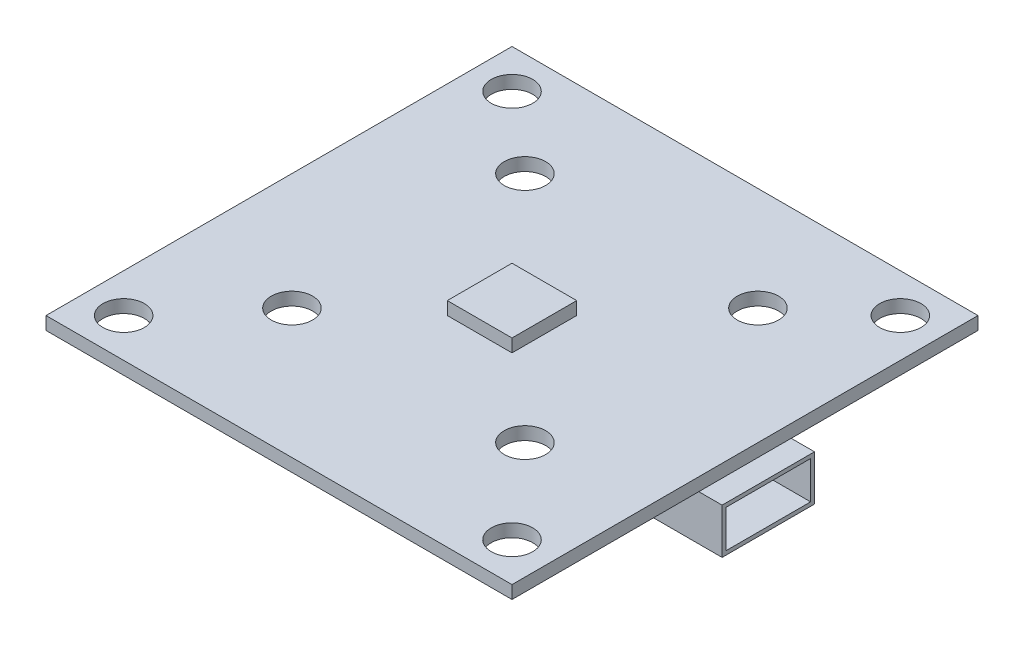
ISO-10303-21;
HEADER;
FILE_DESCRIPTION(('STEP AP214'),'2;1');
FILE_NAME('part.step','',(''),(''),'','','');
FILE_SCHEMA(('AUTOMOTIVE_DESIGN { 1 0 10303 214 1 1 1 1 }'));
ENDSEC;
DATA;
#1=APPLICATION_CONTEXT('core data for automotive mechanical design processes');
#2=APPLICATION_PROTOCOL_DEFINITION('international standard','automotive_design',2000,#1);
#3=PRODUCT_CONTEXT('',#1,'mechanical');
#4=PRODUCT('Part','Part','',(#3));
#5=PRODUCT_RELATED_PRODUCT_CATEGORY('part','',(#4));
#6=PRODUCT_DEFINITION_FORMATION('','',#4);
#7=PRODUCT_DEFINITION_CONTEXT('part definition',#1,'design');
#8=PRODUCT_DEFINITION('design','',#6,#7);
#9=PRODUCT_DEFINITION_SHAPE('','',#8);
#10=(LENGTH_UNIT() NAMED_UNIT(*) SI_UNIT(.MILLI.,.METRE.));
#11=(NAMED_UNIT(*) PLANE_ANGLE_UNIT() SI_UNIT($,.RADIAN.));
#12=(NAMED_UNIT(*) SI_UNIT($,.STERADIAN.) SOLID_ANGLE_UNIT());
#13=UNCERTAINTY_MEASURE_WITH_UNIT(LENGTH_MEASURE(1.E-05),#10,'distance_accuracy_value','');
#14=(GEOMETRIC_REPRESENTATION_CONTEXT(3) GLOBAL_UNCERTAINTY_ASSIGNED_CONTEXT((#13)) GLOBAL_UNIT_ASSIGNED_CONTEXT((#10,
#11,#12)) REPRESENTATION_CONTEXT('',''));
#15=CARTESIAN_POINT('',(0.,0.,0.));
#16=DIRECTION('',(0.,0.,1.));
#17=DIRECTION('',(1.,0.,0.));
#18=AXIS2_PLACEMENT_3D('',#15,#16,#17);
#19=CARTESIAN_POINT('',(19.8,-3.5,3.56877157481258));
#20=DIRECTION('',(-1.,0.,0.));
#21=DIRECTION('',(0.,0.,1.));
#22=AXIS2_PLACEMENT_3D('',#19,#20,#21);
#23=PLANE('',#22);
#24=DIRECTION('',(0.,0.,1.));
#25=VECTOR('',#24,1.);
#26=CARTESIAN_POINT('',(19.8,0.,3.56877157481258));
#27=LINE('',#26,#25);
#28=CARTESIAN_POINT('',(19.8,0.,-3.56877157481258));
#29=VERTEX_POINT('',#28);
#30=CARTESIAN_POINT('',(19.8,0.,3.56877157481258));
#31=VERTEX_POINT('',#30);
#32=EDGE_CURVE('E154',#29,#31,#27,.T.);
#33=ORIENTED_EDGE('',*,*,#32,.T.);
#34=DIRECTION('',(0.,1.,0.));
#35=VECTOR('',#34,1.);
#36=CARTESIAN_POINT('',(19.8,-3.5,3.56877157481258));
#37=LINE('',#36,#35);
#38=CARTESIAN_POINT('',(19.8,-3.5,3.56877157481258));
#39=VERTEX_POINT('',#38);
#40=EDGE_CURVE('E12',#39,#31,#37,.T.);
#41=ORIENTED_EDGE('',*,*,#40,.F.);
#42=DIRECTION('',(0.,0.,1.));
#43=VECTOR('',#42,1.);
#44=CARTESIAN_POINT('',(19.8,-3.5,3.56877157481258));
#45=LINE('',#44,#43);
#46=CARTESIAN_POINT('',(19.8,-3.5,-3.56877157481258));
#47=VERTEX_POINT('',#46);
#48=EDGE_CURVE('E159',#47,#39,#45,.T.);
#49=ORIENTED_EDGE('',*,*,#48,.F.);
#50=DIRECTION('',(0.,1.,0.));
#51=VECTOR('',#50,1.);
#52=CARTESIAN_POINT('',(19.8,-3.5,-3.56877157481258));
#53=LINE('',#52,#51);
#54=EDGE_CURVE('E165',#47,#29,#53,.T.);
#55=ORIENTED_EDGE('',*,*,#54,.T.);
#56=EDGE_LOOP('',(#33,#41,#49,#55));
#57=FACE_BOUND('',#56,.T.);
#58=DIRECTION('',(0.,0.,1.));
#59=VECTOR('',#58,1.);
#60=CARTESIAN_POINT('',(19.8,-0.3,-3.56877157481258));
#61=LINE('',#60,#59);
#62=CARTESIAN_POINT('',(19.8,-0.3,-3.26877157481258));
#63=VERTEX_POINT('',#62);
#64=CARTESIAN_POINT('',(19.8,-0.3,3.26877157481258));
#65=VERTEX_POINT('',#64);
#66=EDGE_CURVE('E125',#63,#65,#61,.T.);
#67=ORIENTED_EDGE('',*,*,#66,.F.);
#68=DIRECTION('',(0.,1.,0.));
#69=VECTOR('',#68,1.);
#70=CARTESIAN_POINT('',(19.8,-3.5,-3.26877157481258));
#71=LINE('',#70,#69);
#72=CARTESIAN_POINT('',(19.8,-3.2,-3.26877157481258));
#73=VERTEX_POINT('',#72);
#74=EDGE_CURVE('E148',#73,#63,#71,.T.);
#75=ORIENTED_EDGE('',*,*,#74,.F.);
#76=DIRECTION('',(0.,0.,1.));
#77=VECTOR('',#76,1.);
#78=CARTESIAN_POINT('',(19.8,-3.2,-3.56877157481258));
#79=LINE('',#78,#77);
#80=CARTESIAN_POINT('',(19.8,-3.2,3.26877157481258));
#81=VERTEX_POINT('',#80);
#82=EDGE_CURVE('E59',#73,#81,#79,.T.);
#83=ORIENTED_EDGE('',*,*,#82,.T.);
#84=DIRECTION('',(0.,1.,0.));
#85=VECTOR('',#84,1.);
#86=CARTESIAN_POINT('',(19.8,-3.5,3.26877157481258));
#87=LINE('',#86,#85);
#88=EDGE_CURVE('E136',#81,#65,#87,.T.);
#89=ORIENTED_EDGE('',*,*,#88,.T.);
#90=EDGE_LOOP('',(#67,#75,#83,#89));
#91=FACE_BOUND('',#90,.T.);
#92=ADVANCED_FACE('F45',(#57,#91),#23,.F.);
#93=CARTESIAN_POINT('',(19.8,-3.5,3.56877157481258));
#94=DIRECTION('',(0.,0.,-1.));
#95=DIRECTION('',(-1.,0.,0.));
#96=AXIS2_PLACEMENT_3D('',#93,#94,#95);
#97=PLANE('',#96);
#98=DIRECTION('',(-1.,0.,0.));
#99=VECTOR('',#98,1.);
#100=CARTESIAN_POINT('',(19.8,0.,3.56877157481258));
#101=LINE('',#100,#99);
#102=CARTESIAN_POINT('',(11.8364257231282,0.,3.56877157481258));
#103=VERTEX_POINT('',#102);
#104=EDGE_CURVE('E168',#31,#103,#101,.T.);
#105=ORIENTED_EDGE('',*,*,#104,.T.);
#106=DIRECTION('',(0.,1.,0.));
#107=VECTOR('',#106,1.);
#108=CARTESIAN_POINT('',(11.8364257231282,-3.5,3.56877157481258));
#109=LINE('',#108,#107);
#110=CARTESIAN_POINT('',(11.8364257231282,-3.5,3.56877157481258));
#111=VERTEX_POINT('',#110);
#112=EDGE_CURVE('E52',#111,#103,#109,.T.);
#113=ORIENTED_EDGE('',*,*,#112,.F.);
#114=DIRECTION('',(-1.,0.,0.));
#115=VECTOR('',#114,1.);
#116=CARTESIAN_POINT('',(19.8,-3.5,3.56877157481258));
#117=LINE('',#116,#115);
#118=EDGE_CURVE('E96',#39,#111,#117,.T.);
#119=ORIENTED_EDGE('',*,*,#118,.F.);
#120=ORIENTED_EDGE('',*,*,#40,.T.);
#121=EDGE_LOOP('',(#105,#113,#119,#120));
#122=FACE_BOUND('',#121,.T.);
#123=ADVANCED_FACE('F197',(#122),#97,.F.);
#124=CARTESIAN_POINT('',(11.8364257231282,-3.5,3.56877157481258));
#125=DIRECTION('',(1.,0.,0.));
#126=DIRECTION('',(0.,0.,-1.));
#127=AXIS2_PLACEMENT_3D('',#124,#125,#126);
#128=PLANE('',#127);
#129=DIRECTION('',(0.,0.,-1.));
#130=VECTOR('',#129,1.);
#131=CARTESIAN_POINT('',(11.8364257231282,0.,3.56877157481258));
#132=LINE('',#131,#130);
#133=CARTESIAN_POINT('',(11.8364257231282,0.,-3.56877157481258));
#134=VERTEX_POINT('',#133);
#135=EDGE_CURVE('E170',#103,#134,#132,.T.);
#136=ORIENTED_EDGE('',*,*,#135,.T.);
#137=DIRECTION('',(0.,1.,0.));
#138=VECTOR('',#137,1.);
#139=CARTESIAN_POINT('',(11.8364257231282,-3.5,-3.56877157481258));
#140=LINE('',#139,#138);
#141=CARTESIAN_POINT('',(11.8364257231282,-3.5,-3.56877157481258));
#142=VERTEX_POINT('',#141);
#143=EDGE_CURVE('E174',#142,#134,#140,.T.);
#144=ORIENTED_EDGE('',*,*,#143,.F.);
#145=DIRECTION('',(0.,0.,-1.));
#146=VECTOR('',#145,1.);
#147=CARTESIAN_POINT('',(11.8364257231282,-3.5,3.56877157481258));
#148=LINE('',#147,#146);
#149=EDGE_CURVE('E162',#111,#142,#148,.T.);
#150=ORIENTED_EDGE('',*,*,#149,.F.);
#151=ORIENTED_EDGE('',*,*,#112,.T.);
#152=EDGE_LOOP('',(#136,#144,#150,#151));
#153=FACE_BOUND('',#152,.T.);
#154=ADVANCED_FACE('F179',(#153),#128,.F.);
#155=CARTESIAN_POINT('',(19.8,-3.5,-3.56877157481258));
#156=DIRECTION('',(0.,0.,1.));
#157=DIRECTION('',(1.,0.,0.));
#158=AXIS2_PLACEMENT_3D('',#155,#156,#157);
#159=PLANE('',#158);
#160=DIRECTION('',(1.,0.,0.));
#161=VECTOR('',#160,1.);
#162=CARTESIAN_POINT('',(19.8,0.,-3.56877157481258));
#163=LINE('',#162,#161);
#164=EDGE_CURVE('E89',#134,#29,#163,.T.);
#165=ORIENTED_EDGE('',*,*,#164,.T.);
#166=ORIENTED_EDGE('',*,*,#54,.F.);
#167=DIRECTION('',(1.,0.,0.));
#168=VECTOR('',#167,1.);
#169=CARTESIAN_POINT('',(19.8,-3.5,-3.56877157481258));
#170=LINE('',#169,#168);
#171=EDGE_CURVE('E68',#142,#47,#170,.T.);
#172=ORIENTED_EDGE('',*,*,#171,.F.);
#173=ORIENTED_EDGE('',*,*,#143,.T.);
#174=EDGE_LOOP('',(#165,#166,#172,#173));
#175=FACE_BOUND('',#174,.T.);
#176=ADVANCED_FACE('F188',(#175),#159,.F.);
#177=CARTESIAN_POINT('',(19.8,-3.5,-3.56877157481258));
#178=DIRECTION('',(0.,1.,0.));
#179=DIRECTION('',(0.,0.,1.));
#180=AXIS2_PLACEMENT_3D('',#177,#178,#179);
#181=PLANE('',#180);
#182=ORIENTED_EDGE('',*,*,#48,.T.);
#183=ORIENTED_EDGE('',*,*,#118,.T.);
#184=ORIENTED_EDGE('',*,*,#149,.T.);
#185=ORIENTED_EDGE('',*,*,#171,.T.);
#186=EDGE_LOOP('',(#182,#183,#184,#185));
#187=FACE_BOUND('',#186,.T.);
#188=ADVANCED_FACE('F190',(#187),#181,.F.);
#189=CARTESIAN_POINT('',(19.8,0.,-3.56877157481258));
#190=DIRECTION('',(0.,1.,0.));
#191=DIRECTION('',(0.,0.,1.));
#192=AXIS2_PLACEMENT_3D('',#189,#190,#191);
#193=PLANE('',#192);
#194=ORIENTED_EDGE('',*,*,#32,.F.);
#195=ORIENTED_EDGE('',*,*,#164,.F.);
#196=ORIENTED_EDGE('',*,*,#135,.F.);
#197=ORIENTED_EDGE('',*,*,#104,.F.);
#198=EDGE_LOOP('',(#194,#195,#196,#197));
#199=FACE_BOUND('',#198,.T.);
#200=ADVANCED_FACE('F183',(#199),#193,.T.);
#201=CARTESIAN_POINT('',(19.8,-3.5,3.26877157481258));
#202=DIRECTION('',(0.,0.,-1.));
#203=DIRECTION('',(-1.,0.,0.));
#204=AXIS2_PLACEMENT_3D('',#201,#202,#203);
#205=PLANE('',#204);
#206=DIRECTION('',(-1.,0.,0.));
#207=VECTOR('',#206,1.);
#208=CARTESIAN_POINT('',(19.8,-0.3,3.26877157481258));
#209=LINE('',#208,#207);
#210=CARTESIAN_POINT('',(12.1364257231282,-0.3,3.26877157481258));
#211=VERTEX_POINT('',#210);
#212=EDGE_CURVE('E118',#65,#211,#209,.T.);
#213=ORIENTED_EDGE('',*,*,#212,.F.);
#214=ORIENTED_EDGE('',*,*,#88,.F.);
#215=DIRECTION('',(-1.,0.,0.));
#216=VECTOR('',#215,1.);
#217=CARTESIAN_POINT('',(19.8,-3.2,3.26877157481258));
#218=LINE('',#217,#216);
#219=CARTESIAN_POINT('',(12.1364257231282,-3.2,3.26877157481258));
#220=VERTEX_POINT('',#219);
#221=EDGE_CURVE('E133',#81,#220,#218,.T.);
#222=ORIENTED_EDGE('',*,*,#221,.T.);
#223=DIRECTION('',(0.,1.,0.));
#224=VECTOR('',#223,1.);
#225=CARTESIAN_POINT('',(12.1364257231282,-3.5,3.26877157481258));
#226=LINE('',#225,#224);
#227=EDGE_CURVE('E131',#220,#211,#226,.T.);
#228=ORIENTED_EDGE('',*,*,#227,.T.);
#229=EDGE_LOOP('',(#213,#214,#222,#228));
#230=FACE_BOUND('',#229,.T.);
#231=ADVANCED_FACE('F132',(#230),#205,.T.);
#232=CARTESIAN_POINT('',(12.1364257231282,-3.5,3.56877157481258));
#233=DIRECTION('',(1.,0.,0.));
#234=DIRECTION('',(0.,0.,-1.));
#235=AXIS2_PLACEMENT_3D('',#232,#233,#234);
#236=PLANE('',#235);
#237=DIRECTION('',(0.,0.,-1.));
#238=VECTOR('',#237,1.);
#239=CARTESIAN_POINT('',(12.1364257231282,-0.3,-3.56877157481258));
#240=LINE('',#239,#238);
#241=CARTESIAN_POINT('',(12.1364257231282,-0.3,-3.26877157481258));
#242=VERTEX_POINT('',#241);
#243=EDGE_CURVE('E122',#211,#242,#240,.T.);
#244=ORIENTED_EDGE('',*,*,#243,.F.);
#245=ORIENTED_EDGE('',*,*,#227,.F.);
#246=DIRECTION('',(0.,0.,-1.));
#247=VECTOR('',#246,1.);
#248=CARTESIAN_POINT('',(12.1364257231282,-3.2,-3.56877157481258));
#249=LINE('',#248,#247);
#250=CARTESIAN_POINT('',(12.1364257231282,-3.2,-3.26877157481258));
#251=VERTEX_POINT('',#250);
#252=EDGE_CURVE('E149',#220,#251,#249,.T.);
#253=ORIENTED_EDGE('',*,*,#252,.T.);
#254=DIRECTION('',(0.,1.,0.));
#255=VECTOR('',#254,1.);
#256=CARTESIAN_POINT('',(12.1364257231282,-3.5,-3.26877157481258));
#257=LINE('',#256,#255);
#258=EDGE_CURVE('E137',#251,#242,#257,.T.);
#259=ORIENTED_EDGE('',*,*,#258,.T.);
#260=EDGE_LOOP('',(#244,#245,#253,#259));
#261=FACE_BOUND('',#260,.T.);
#262=ADVANCED_FACE('F139',(#261),#236,.T.);
#263=CARTESIAN_POINT('',(19.8,-3.5,-3.26877157481258));
#264=DIRECTION('',(0.,0.,1.));
#265=DIRECTION('',(1.,0.,0.));
#266=AXIS2_PLACEMENT_3D('',#263,#264,#265);
#267=PLANE('',#266);
#268=DIRECTION('',(1.,0.,0.));
#269=VECTOR('',#268,1.);
#270=CARTESIAN_POINT('',(19.8,-0.3,-3.26877157481258));
#271=LINE('',#270,#269);
#272=EDGE_CURVE('E142',#242,#63,#271,.T.);
#273=ORIENTED_EDGE('',*,*,#272,.F.);
#274=ORIENTED_EDGE('',*,*,#258,.F.);
#275=DIRECTION('',(1.,0.,0.));
#276=VECTOR('',#275,1.);
#277=CARTESIAN_POINT('',(19.8,-3.2,-3.26877157481258));
#278=LINE('',#277,#276);
#279=EDGE_CURVE('E150',#251,#73,#278,.T.);
#280=ORIENTED_EDGE('',*,*,#279,.T.);
#281=ORIENTED_EDGE('',*,*,#74,.T.);
#282=EDGE_LOOP('',(#273,#274,#280,#281));
#283=FACE_BOUND('',#282,.T.);
#284=ADVANCED_FACE('F248',(#283),#267,.T.);
#285=CARTESIAN_POINT('',(19.8,-3.2,-3.56877157481258));
#286=DIRECTION('',(0.,1.,0.));
#287=DIRECTION('',(0.,0.,1.));
#288=AXIS2_PLACEMENT_3D('',#285,#286,#287);
#289=PLANE('',#288);
#290=ORIENTED_EDGE('',*,*,#82,.F.);
#291=ORIENTED_EDGE('',*,*,#279,.F.);
#292=ORIENTED_EDGE('',*,*,#252,.F.);
#293=ORIENTED_EDGE('',*,*,#221,.F.);
#294=EDGE_LOOP('',(#290,#291,#292,#293));
#295=FACE_BOUND('',#294,.T.);
#296=ADVANCED_FACE('F257',(#295),#289,.T.);
#297=CARTESIAN_POINT('',(19.8,-0.3,-3.56877157481258));
#298=DIRECTION('',(0.,1.,0.));
#299=DIRECTION('',(0.,0.,1.));
#300=AXIS2_PLACEMENT_3D('',#297,#298,#299);
#301=PLANE('',#300);
#302=ORIENTED_EDGE('',*,*,#66,.T.);
#303=ORIENTED_EDGE('',*,*,#212,.T.);
#304=ORIENTED_EDGE('',*,*,#243,.T.);
#305=ORIENTED_EDGE('',*,*,#272,.T.);
#306=EDGE_LOOP('',(#302,#303,#304,#305));
#307=FACE_BOUND('',#306,.T.);
#308=ADVANCED_FACE('F120',(#307),#301,.F.);
#309=CLOSED_SHELL('',(#92,#123,#154,#176,#188,#200,#231,#262,#284,#296,#308));
#310=MANIFOLD_SOLID_BREP('B2',#309);
#311=CARTESIAN_POINT('',(-2.5,2.,-2.5));
#312=DIRECTION('',(1.,0.,0.));
#313=DIRECTION('',(0.,0.,-1.));
#314=AXIS2_PLACEMENT_3D('',#311,#312,#313);
#315=PLANE('',#314);
#316=DIRECTION('',(0.,0.,1.));
#317=VECTOR('',#316,1.);
#318=CARTESIAN_POINT('',(-2.5,1.,-2.5));
#319=LINE('',#318,#317);
#320=CARTESIAN_POINT('',(-2.5,1.,-2.5));
#321=VERTEX_POINT('',#320);
#322=CARTESIAN_POINT('',(-2.5,1.,2.5));
#323=VERTEX_POINT('',#322);
#324=EDGE_CURVE('E355',#321,#323,#319,.T.);
#325=ORIENTED_EDGE('',*,*,#324,.T.);
#326=DIRECTION('',(0.,-1.,0.));
#327=VECTOR('',#326,1.);
#328=CARTESIAN_POINT('',(-2.5,2.,2.5));
#329=LINE('',#328,#327);
#330=CARTESIAN_POINT('',(-2.5,2.,2.5));
#331=VERTEX_POINT('',#330);
#332=EDGE_CURVE('E43',#331,#323,#329,.T.);
#333=ORIENTED_EDGE('',*,*,#332,.F.);
#334=DIRECTION('',(0.,0.,1.));
#335=VECTOR('',#334,1.);
#336=CARTESIAN_POINT('',(-2.5,2.,-2.5));
#337=LINE('',#336,#335);
#338=CARTESIAN_POINT('',(-2.5,2.,-2.5));
#339=VERTEX_POINT('',#338);
#340=EDGE_CURVE('E343',#339,#331,#337,.T.);
#341=ORIENTED_EDGE('',*,*,#340,.F.);
#342=DIRECTION('',(0.,-1.,0.));
#343=VECTOR('',#342,1.);
#344=CARTESIAN_POINT('',(-2.5,2.,-2.5));
#345=LINE('',#344,#343);
#346=EDGE_CURVE('E351',#339,#321,#345,.T.);
#347=ORIENTED_EDGE('',*,*,#346,.T.);
#348=EDGE_LOOP('',(#325,#333,#341,#347));
#349=FACE_BOUND('',#348,.T.);
#350=ADVANCED_FACE('F292',(#349),#315,.F.);
#351=CARTESIAN_POINT('',(-2.5,2.,2.5));
#352=DIRECTION('',(0.,0.,-1.));
#353=DIRECTION('',(-1.,0.,0.));
#354=AXIS2_PLACEMENT_3D('',#351,#352,#353);
#355=PLANE('',#354);
#356=DIRECTION('',(1.,0.,0.));
#357=VECTOR('',#356,1.);
#358=CARTESIAN_POINT('',(-2.5,1.,2.5));
#359=LINE('',#358,#357);
#360=CARTESIAN_POINT('',(2.5,1.,2.5));
#361=VERTEX_POINT('',#360);
#362=EDGE_CURVE('E347',#323,#361,#359,.T.);
#363=ORIENTED_EDGE('',*,*,#362,.T.);
#364=DIRECTION('',(0.,-1.,0.));
#365=VECTOR('',#364,1.);
#366=CARTESIAN_POINT('',(2.5,2.,2.5));
#367=LINE('',#366,#365);
#368=CARTESIAN_POINT('',(2.5,2.,2.5));
#369=VERTEX_POINT('',#368);
#370=EDGE_CURVE('E300',#369,#361,#367,.T.);
#371=ORIENTED_EDGE('',*,*,#370,.F.);
#372=DIRECTION('',(1.,0.,0.));
#373=VECTOR('',#372,1.);
#374=CARTESIAN_POINT('',(-2.5,2.,2.5));
#375=LINE('',#374,#373);
#376=EDGE_CURVE('E338',#331,#369,#375,.T.);
#377=ORIENTED_EDGE('',*,*,#376,.F.);
#378=ORIENTED_EDGE('',*,*,#332,.T.);
#379=EDGE_LOOP('',(#363,#371,#377,#378));
#380=FACE_BOUND('',#379,.T.);
#381=ADVANCED_FACE('F346',(#380),#355,.F.);
#382=CARTESIAN_POINT('',(2.5,2.,-2.5));
#383=DIRECTION('',(-1.,0.,0.));
#384=DIRECTION('',(0.,0.,1.));
#385=AXIS2_PLACEMENT_3D('',#382,#383,#384);
#386=PLANE('',#385);
#387=DIRECTION('',(0.,0.,-1.));
#388=VECTOR('',#387,1.);
#389=CARTESIAN_POINT('',(2.5,1.,-2.5));
#390=LINE('',#389,#388);
#391=CARTESIAN_POINT('',(2.5,1.,-2.5));
#392=VERTEX_POINT('',#391);
#393=EDGE_CURVE('E325',#361,#392,#390,.T.);
#394=ORIENTED_EDGE('',*,*,#393,.T.);
#395=DIRECTION('',(0.,-1.,0.));
#396=VECTOR('',#395,1.);
#397=CARTESIAN_POINT('',(2.5,2.,-2.5));
#398=LINE('',#397,#396);
#399=CARTESIAN_POINT('',(2.5,2.,-2.5));
#400=VERTEX_POINT('',#399);
#401=EDGE_CURVE('E348',#400,#392,#398,.T.);
#402=ORIENTED_EDGE('',*,*,#401,.F.);
#403=DIRECTION('',(0.,0.,-1.));
#404=VECTOR('',#403,1.);
#405=CARTESIAN_POINT('',(2.5,2.,-2.5));
#406=LINE('',#405,#404);
#407=EDGE_CURVE('E341',#369,#400,#406,.T.);
#408=ORIENTED_EDGE('',*,*,#407,.F.);
#409=ORIENTED_EDGE('',*,*,#370,.T.);
#410=EDGE_LOOP('',(#394,#402,#408,#409));
#411=FACE_BOUND('',#410,.T.);
#412=ADVANCED_FACE('F349',(#411),#386,.F.);
#413=CARTESIAN_POINT('',(-2.5,2.,-2.5));
#414=DIRECTION('',(0.,0.,1.));
#415=DIRECTION('',(1.,0.,0.));
#416=AXIS2_PLACEMENT_3D('',#413,#414,#415);
#417=PLANE('',#416);
#418=DIRECTION('',(-1.,0.,0.));
#419=VECTOR('',#418,1.);
#420=CARTESIAN_POINT('',(-2.5,1.,-2.5));
#421=LINE('',#420,#419);
#422=EDGE_CURVE('E331',#392,#321,#421,.T.);
#423=ORIENTED_EDGE('',*,*,#422,.T.);
#424=ORIENTED_EDGE('',*,*,#346,.F.);
#425=DIRECTION('',(-1.,0.,0.));
#426=VECTOR('',#425,1.);
#427=CARTESIAN_POINT('',(-2.5,2.,-2.5));
#428=LINE('',#427,#426);
#429=EDGE_CURVE('E308',#400,#339,#428,.T.);
#430=ORIENTED_EDGE('',*,*,#429,.F.);
#431=ORIENTED_EDGE('',*,*,#401,.T.);
#432=EDGE_LOOP('',(#423,#424,#430,#431));
#433=FACE_BOUND('',#432,.T.);
#434=ADVANCED_FACE('F362',(#433),#417,.F.);
#435=CARTESIAN_POINT('',(-2.5,2.,2.5));
#436=DIRECTION('',(0.,1.,0.));
#437=DIRECTION('',(0.,0.,1.));
#438=AXIS2_PLACEMENT_3D('',#435,#436,#437);
#439=PLANE('',#438);
#440=ORIENTED_EDGE('',*,*,#340,.T.);
#441=ORIENTED_EDGE('',*,*,#376,.T.);
#442=ORIENTED_EDGE('',*,*,#407,.T.);
#443=ORIENTED_EDGE('',*,*,#429,.T.);
#444=EDGE_LOOP('',(#440,#441,#442,#443));
#445=FACE_BOUND('',#444,.T.);
#446=ADVANCED_FACE('F339',(#445),#439,.T.);
#447=CARTESIAN_POINT('',(-2.5,1.,2.5));
#448=DIRECTION('',(0.,1.,0.));
#449=DIRECTION('',(0.,0.,1.));
#450=AXIS2_PLACEMENT_3D('',#447,#448,#449);
#451=PLANE('',#450);
#452=ORIENTED_EDGE('',*,*,#324,.F.);
#453=ORIENTED_EDGE('',*,*,#422,.F.);
#454=ORIENTED_EDGE('',*,*,#393,.F.);
#455=ORIENTED_EDGE('',*,*,#362,.F.);
#456=EDGE_LOOP('',(#452,#453,#454,#455));
#457=FACE_BOUND('',#456,.T.);
#458=ADVANCED_FACE('F365',(#457),#451,.F.);
#459=CLOSED_SHELL('',(#350,#381,#412,#434,#446,#458));
#460=MANIFOLD_SOLID_BREP('B6',#459);
#461=CARTESIAN_POINT('',(-18.,1.,-18.));
#462=DIRECTION('',(1.,0.,0.));
#463=DIRECTION('',(0.,0.,-1.));
#464=AXIS2_PLACEMENT_3D('',#461,#462,#463);
#465=PLANE('',#464);
#466=DIRECTION('',(0.,0.,1.));
#467=VECTOR('',#466,1.);
#468=CARTESIAN_POINT('',(-18.,0.,-18.));
#469=LINE('',#468,#467);
#470=CARTESIAN_POINT('',(-18.,0.,-18.));
#471=VERTEX_POINT('',#470);
#472=CARTESIAN_POINT('',(-18.,0.,18.));
#473=VERTEX_POINT('',#472);
#474=EDGE_CURVE('E488',#471,#473,#469,.T.);
#475=ORIENTED_EDGE('',*,*,#474,.T.);
#476=DIRECTION('',(0.,-1.,0.));
#477=VECTOR('',#476,1.);
#478=CARTESIAN_POINT('',(-18.,1.,18.));
#479=LINE('',#478,#477);
#480=CARTESIAN_POINT('',(-18.,1.,18.));
#481=VERTEX_POINT('',#480);
#482=EDGE_CURVE('E290',#481,#473,#479,.T.);
#483=ORIENTED_EDGE('',*,*,#482,.F.);
#484=DIRECTION('',(0.,0.,1.));
#485=VECTOR('',#484,1.);
#486=CARTESIAN_POINT('',(-18.,1.,-18.));
#487=LINE('',#486,#485);
#488=CARTESIAN_POINT('',(-18.,1.,-18.));
#489=VERTEX_POINT('',#488);
#490=EDGE_CURVE('E476',#489,#481,#487,.T.);
#491=ORIENTED_EDGE('',*,*,#490,.F.);
#492=DIRECTION('',(0.,-1.,0.));
#493=VECTOR('',#492,1.);
#494=CARTESIAN_POINT('',(-18.,1.,-18.));
#495=LINE('',#494,#493);
#496=EDGE_CURVE('E484',#489,#471,#495,.T.);
#497=ORIENTED_EDGE('',*,*,#496,.T.);
#498=EDGE_LOOP('',(#475,#483,#491,#497));
#499=FACE_BOUND('',#498,.T.);
#500=ADVANCED_FACE('F425',(#499),#465,.F.);
#501=CARTESIAN_POINT('',(-18.,1.,18.));
#502=DIRECTION('',(0.,0.,-1.));
#503=DIRECTION('',(-1.,0.,0.));
#504=AXIS2_PLACEMENT_3D('',#501,#502,#503);
#505=PLANE('',#504);
#506=DIRECTION('',(1.,0.,0.));
#507=VECTOR('',#506,1.);
#508=CARTESIAN_POINT('',(-18.,0.,18.));
#509=LINE('',#508,#507);
#510=CARTESIAN_POINT('',(18.,0.,18.));
#511=VERTEX_POINT('',#510);
#512=EDGE_CURVE('E480',#473,#511,#509,.T.);
#513=ORIENTED_EDGE('',*,*,#512,.T.);
#514=DIRECTION('',(0.,-1.,0.));
#515=VECTOR('',#514,1.);
#516=CARTESIAN_POINT('',(18.,1.,18.));
#517=LINE('',#516,#515);
#518=CARTESIAN_POINT('',(18.,1.,18.));
#519=VERTEX_POINT('',#518);
#520=EDGE_CURVE('E433',#519,#511,#517,.T.);
#521=ORIENTED_EDGE('',*,*,#520,.F.);
#522=DIRECTION('',(1.,0.,0.));
#523=VECTOR('',#522,1.);
#524=CARTESIAN_POINT('',(-18.,1.,18.));
#525=LINE('',#524,#523);
#526=EDGE_CURVE('E471',#481,#519,#525,.T.);
#527=ORIENTED_EDGE('',*,*,#526,.F.);
#528=ORIENTED_EDGE('',*,*,#482,.T.);
#529=EDGE_LOOP('',(#513,#521,#527,#528));
#530=FACE_BOUND('',#529,.T.);
#531=ADVANCED_FACE('F479',(#530),#505,.F.);
#532=CARTESIAN_POINT('',(18.,1.,-18.));
#533=DIRECTION('',(-1.,0.,0.));
#534=DIRECTION('',(0.,0.,1.));
#535=AXIS2_PLACEMENT_3D('',#532,#533,#534);
#536=PLANE('',#535);
#537=DIRECTION('',(0.,0.,-1.));
#538=VECTOR('',#537,1.);
#539=CARTESIAN_POINT('',(18.,0.,-18.));
#540=LINE('',#539,#538);
#541=CARTESIAN_POINT('',(18.,0.,-18.));
#542=VERTEX_POINT('',#541);
#543=EDGE_CURVE('E458',#511,#542,#540,.T.);
#544=ORIENTED_EDGE('',*,*,#543,.T.);
#545=DIRECTION('',(0.,-1.,0.));
#546=VECTOR('',#545,1.);
#547=CARTESIAN_POINT('',(18.,1.,-18.));
#548=LINE('',#547,#546);
#549=CARTESIAN_POINT('',(18.,1.,-18.));
#550=VERTEX_POINT('',#549);
#551=EDGE_CURVE('E481',#550,#542,#548,.T.);
#552=ORIENTED_EDGE('',*,*,#551,.F.);
#553=DIRECTION('',(0.,0.,-1.));
#554=VECTOR('',#553,1.);
#555=CARTESIAN_POINT('',(18.,1.,-18.));
#556=LINE('',#555,#554);
#557=EDGE_CURVE('E474',#519,#550,#556,.T.);
#558=ORIENTED_EDGE('',*,*,#557,.F.);
#559=ORIENTED_EDGE('',*,*,#520,.T.);
#560=EDGE_LOOP('',(#544,#552,#558,#559));
#561=FACE_BOUND('',#560,.T.);
#562=ADVANCED_FACE('F482',(#561),#536,.F.);
#563=CARTESIAN_POINT('',(-18.,1.,-18.));
#564=DIRECTION('',(0.,0.,1.));
#565=DIRECTION('',(1.,0.,0.));
#566=AXIS2_PLACEMENT_3D('',#563,#564,#565);
#567=PLANE('',#566);
#568=DIRECTION('',(-1.,0.,0.));
#569=VECTOR('',#568,1.);
#570=CARTESIAN_POINT('',(-18.,0.,-18.));
#571=LINE('',#570,#569);
#572=EDGE_CURVE('E464',#542,#471,#571,.T.);
#573=ORIENTED_EDGE('',*,*,#572,.T.);
#574=ORIENTED_EDGE('',*,*,#496,.F.);
#575=DIRECTION('',(-1.,0.,0.));
#576=VECTOR('',#575,1.);
#577=CARTESIAN_POINT('',(-18.,1.,-18.));
#578=LINE('',#577,#576);
#579=EDGE_CURVE('E441',#550,#489,#578,.T.);
#580=ORIENTED_EDGE('',*,*,#579,.F.);
#581=ORIENTED_EDGE('',*,*,#551,.T.);
#582=EDGE_LOOP('',(#573,#574,#580,#581));
#583=FACE_BOUND('',#582,.T.);
#584=ADVANCED_FACE('F496',(#583),#567,.F.);
#585=CARTESIAN_POINT('',(-18.,1.,18.));
#586=DIRECTION('',(0.,1.,0.));
#587=DIRECTION('',(0.,0.,1.));
#588=AXIS2_PLACEMENT_3D('',#585,#586,#587);
#589=PLANE('',#588);
#590=CARTESIAN_POINT('',(-9.,1.,7.99999999999999));
#591=DIRECTION('',(0.,1.,0.));
#592=DIRECTION('',(0.,0.,-1.));
#593=AXIS2_PLACEMENT_3D('',#590,#591,#592);
#594=CIRCLE('',#593,1.6);
#595=CARTESIAN_POINT('',(-9.,1.,6.4));
#596=VERTEX_POINT('',#595);
#597=EDGE_CURVE('E544',#596,#596,#594,.T.);
#598=ORIENTED_EDGE('',*,*,#597,.F.);
#599=EDGE_LOOP('',(#598));
#600=FACE_BOUND('',#599,.T.);
#601=CARTESIAN_POINT('',(9.00000000000001,1.,7.99999999999999));
#602=DIRECTION('',(0.,1.,0.));
#603=DIRECTION('',(0.,0.,1.));
#604=AXIS2_PLACEMENT_3D('',#601,#602,#603);
#605=CIRCLE('',#604,1.6);
#606=CARTESIAN_POINT('',(9.00000000000001,1.,9.6));
#607=VERTEX_POINT('',#606);
#608=EDGE_CURVE('E538',#607,#607,#605,.T.);
#609=ORIENTED_EDGE('',*,*,#608,.F.);
#610=EDGE_LOOP('',(#609));
#611=FACE_BOUND('',#610,.T.);
#612=CARTESIAN_POINT('',(9.,1.,-10.));
#613=DIRECTION('',(0.,1.,0.));
#614=DIRECTION('',(0.,0.,-1.));
#615=AXIS2_PLACEMENT_3D('',#612,#613,#614);
#616=CIRCLE('',#615,1.6);
#617=CARTESIAN_POINT('',(9.,1.,-11.6));
#618=VERTEX_POINT('',#617);
#619=EDGE_CURVE('E532',#618,#618,#616,.T.);
#620=ORIENTED_EDGE('',*,*,#619,.F.);
#621=EDGE_LOOP('',(#620));
#622=FACE_BOUND('',#621,.T.);
#623=CARTESIAN_POINT('',(-9.,1.,-10.));
#624=DIRECTION('',(0.,1.,0.));
#625=DIRECTION('',(0.,0.,1.));
#626=AXIS2_PLACEMENT_3D('',#623,#624,#625);
#627=CIRCLE('',#626,1.6);
#628=CARTESIAN_POINT('',(-9.,1.,-8.4));
#629=VERTEX_POINT('',#628);
#630=EDGE_CURVE('E526',#629,#629,#627,.T.);
#631=ORIENTED_EDGE('',*,*,#630,.F.);
#632=EDGE_LOOP('',(#631));
#633=FACE_BOUND('',#632,.T.);
#634=CARTESIAN_POINT('',(-15.,1.,15.));
#635=DIRECTION('',(0.,1.,0.));
#636=DIRECTION('',(0.,0.,-1.));
#637=AXIS2_PLACEMENT_3D('',#634,#635,#636);
#638=CIRCLE('',#637,1.6);
#639=CARTESIAN_POINT('',(-15.,1.,13.4));
#640=VERTEX_POINT('',#639);
#641=EDGE_CURVE('E520',#640,#640,#638,.T.);
#642=ORIENTED_EDGE('',*,*,#641,.F.);
#643=EDGE_LOOP('',(#642));
#644=FACE_BOUND('',#643,.T.);
#645=CARTESIAN_POINT('',(15.,1.,15.));
#646=DIRECTION('',(0.,1.,0.));
#647=DIRECTION('',(0.,0.,1.));
#648=AXIS2_PLACEMENT_3D('',#645,#646,#647);
#649=CIRCLE('',#648,1.6);
#650=CARTESIAN_POINT('',(15.,1.,16.6));
#651=VERTEX_POINT('',#650);
#652=EDGE_CURVE('E514',#651,#651,#649,.T.);
#653=ORIENTED_EDGE('',*,*,#652,.F.);
#654=EDGE_LOOP('',(#653));
#655=FACE_BOUND('',#654,.T.);
#656=CARTESIAN_POINT('',(15.,1.,-15.));
#657=DIRECTION('',(0.,1.,0.));
#658=DIRECTION('',(0.,0.,-1.));
#659=AXIS2_PLACEMENT_3D('',#656,#657,#658);
#660=CIRCLE('',#659,1.6);
#661=CARTESIAN_POINT('',(15.,1.,-16.6));
#662=VERTEX_POINT('',#661);
#663=EDGE_CURVE('E508',#662,#662,#660,.T.);
#664=ORIENTED_EDGE('',*,*,#663,.F.);
#665=EDGE_LOOP('',(#664));
#666=FACE_BOUND('',#665,.T.);
#667=CARTESIAN_POINT('',(-15.,1.,-15.));
#668=DIRECTION('',(0.,1.,0.));
#669=DIRECTION('',(0.,0.,1.));
#670=AXIS2_PLACEMENT_3D('',#667,#668,#669);
#671=CIRCLE('',#670,1.6);
#672=CARTESIAN_POINT('',(-15.,1.,-13.4));
#673=VERTEX_POINT('',#672);
#674=EDGE_CURVE('E502',#673,#673,#671,.T.);
#675=ORIENTED_EDGE('',*,*,#674,.F.);
#676=EDGE_LOOP('',(#675));
#677=FACE_BOUND('',#676,.T.);
#678=ORIENTED_EDGE('',*,*,#490,.T.);
#679=ORIENTED_EDGE('',*,*,#526,.T.);
#680=ORIENTED_EDGE('',*,*,#557,.T.);
#681=ORIENTED_EDGE('',*,*,#579,.T.);
#682=EDGE_LOOP('',(#678,#679,#680,#681));
#683=FACE_BOUND('',#682,.T.);
#684=ADVANCED_FACE('F472',(#600,#611,#622,#633,#644,#655,#666,#677,#683),#589,.T.);
#685=CARTESIAN_POINT('',(-18.,0.,18.));
#686=DIRECTION('',(0.,1.,0.));
#687=DIRECTION('',(0.,0.,1.));
#688=AXIS2_PLACEMENT_3D('',#685,#686,#687);
#689=PLANE('',#688);
#690=CARTESIAN_POINT('',(-9.,0.,7.99999999999999));
#691=DIRECTION('',(0.,1.,0.));
#692=DIRECTION('',(0.,0.,-1.));
#693=AXIS2_PLACEMENT_3D('',#690,#691,#692);
#694=CIRCLE('',#693,1.6);
#695=CARTESIAN_POINT('',(-9.,0.,6.4));
#696=VERTEX_POINT('',#695);
#697=EDGE_CURVE('E541',#696,#696,#694,.T.);
#698=ORIENTED_EDGE('',*,*,#697,.T.);
#699=EDGE_LOOP('',(#698));
#700=FACE_BOUND('',#699,.T.);
#701=CARTESIAN_POINT('',(9.00000000000001,0.,7.99999999999999));
#702=DIRECTION('',(0.,1.,0.));
#703=DIRECTION('',(0.,0.,1.));
#704=AXIS2_PLACEMENT_3D('',#701,#702,#703);
#705=CIRCLE('',#704,1.6);
#706=CARTESIAN_POINT('',(9.00000000000001,0.,9.6));
#707=VERTEX_POINT('',#706);
#708=EDGE_CURVE('E535',#707,#707,#705,.T.);
#709=ORIENTED_EDGE('',*,*,#708,.T.);
#710=EDGE_LOOP('',(#709));
#711=FACE_BOUND('',#710,.T.);
#712=CARTESIAN_POINT('',(9.,0.,-10.));
#713=DIRECTION('',(0.,1.,0.));
#714=DIRECTION('',(0.,0.,-1.));
#715=AXIS2_PLACEMENT_3D('',#712,#713,#714);
#716=CIRCLE('',#715,1.6);
#717=CARTESIAN_POINT('',(9.,0.,-11.6));
#718=VERTEX_POINT('',#717);
#719=EDGE_CURVE('E529',#718,#718,#716,.T.);
#720=ORIENTED_EDGE('',*,*,#719,.T.);
#721=EDGE_LOOP('',(#720));
#722=FACE_BOUND('',#721,.T.);
#723=CARTESIAN_POINT('',(-9.,0.,-10.));
#724=DIRECTION('',(0.,1.,0.));
#725=DIRECTION('',(0.,0.,1.));
#726=AXIS2_PLACEMENT_3D('',#723,#724,#725);
#727=CIRCLE('',#726,1.6);
#728=CARTESIAN_POINT('',(-9.,0.,-8.4));
#729=VERTEX_POINT('',#728);
#730=EDGE_CURVE('E523',#729,#729,#727,.T.);
#731=ORIENTED_EDGE('',*,*,#730,.T.);
#732=EDGE_LOOP('',(#731));
#733=FACE_BOUND('',#732,.T.);
#734=CARTESIAN_POINT('',(-15.,0.,15.));
#735=DIRECTION('',(0.,1.,0.));
#736=DIRECTION('',(0.,0.,-1.));
#737=AXIS2_PLACEMENT_3D('',#734,#735,#736);
#738=CIRCLE('',#737,1.6);
#739=CARTESIAN_POINT('',(-15.,0.,13.4));
#740=VERTEX_POINT('',#739);
#741=EDGE_CURVE('E517',#740,#740,#738,.T.);
#742=ORIENTED_EDGE('',*,*,#741,.T.);
#743=EDGE_LOOP('',(#742));
#744=FACE_BOUND('',#743,.T.);
#745=CARTESIAN_POINT('',(15.,0.,15.));
#746=DIRECTION('',(0.,1.,0.));
#747=DIRECTION('',(0.,0.,1.));
#748=AXIS2_PLACEMENT_3D('',#745,#746,#747);
#749=CIRCLE('',#748,1.6);
#750=CARTESIAN_POINT('',(15.,0.,16.6));
#751=VERTEX_POINT('',#750);
#752=EDGE_CURVE('E511',#751,#751,#749,.T.);
#753=ORIENTED_EDGE('',*,*,#752,.T.);
#754=EDGE_LOOP('',(#753));
#755=FACE_BOUND('',#754,.T.);
#756=CARTESIAN_POINT('',(15.,0.,-15.));
#757=DIRECTION('',(0.,1.,0.));
#758=DIRECTION('',(0.,0.,-1.));
#759=AXIS2_PLACEMENT_3D('',#756,#757,#758);
#760=CIRCLE('',#759,1.6);
#761=CARTESIAN_POINT('',(15.,0.,-16.6));
#762=VERTEX_POINT('',#761);
#763=EDGE_CURVE('E505',#762,#762,#760,.T.);
#764=ORIENTED_EDGE('',*,*,#763,.T.);
#765=EDGE_LOOP('',(#764));
#766=FACE_BOUND('',#765,.T.);
#767=CARTESIAN_POINT('',(-15.,0.,-15.));
#768=DIRECTION('',(0.,1.,0.));
#769=DIRECTION('',(0.,0.,1.));
#770=AXIS2_PLACEMENT_3D('',#767,#768,#769);
#771=CIRCLE('',#770,1.6);
#772=CARTESIAN_POINT('',(-15.,0.,-13.4));
#773=VERTEX_POINT('',#772);
#774=EDGE_CURVE('E491',#773,#773,#771,.T.);
#775=ORIENTED_EDGE('',*,*,#774,.T.);
#776=EDGE_LOOP('',(#775));
#777=FACE_BOUND('',#776,.T.);
#778=ORIENTED_EDGE('',*,*,#474,.F.);
#779=ORIENTED_EDGE('',*,*,#572,.F.);
#780=ORIENTED_EDGE('',*,*,#543,.F.);
#781=ORIENTED_EDGE('',*,*,#512,.F.);
#782=EDGE_LOOP('',(#778,#779,#780,#781));
#783=FACE_BOUND('',#782,.T.);
#784=ADVANCED_FACE('F499',(#700,#711,#722,#733,#744,#755,#766,#777,#783),#689,.F.);
#785=CARTESIAN_POINT('',(-15.,0.,-15.));
#786=DIRECTION('',(0.,1.,0.));
#787=DIRECTION('',(0.,0.,1.));
#788=AXIS2_PLACEMENT_3D('',#785,#786,#787);
#789=CYLINDRICAL_SURFACE('',#788,1.6);
#790=ORIENTED_EDGE('',*,*,#774,.F.);
#791=EDGE_LOOP('',(#790));
#792=FACE_BOUND('',#791,.T.);
#793=ORIENTED_EDGE('',*,*,#674,.T.);
#794=EDGE_LOOP('',(#793));
#795=FACE_BOUND('',#794,.T.);
#796=ADVANCED_FACE('F576',(#792,#795),#789,.F.);
#797=CARTESIAN_POINT('',(15.,0.,-15.));
#798=DIRECTION('',(0.,1.,0.));
#799=DIRECTION('',(0.,0.,1.));
#800=AXIS2_PLACEMENT_3D('',#797,#798,#799);
#801=CYLINDRICAL_SURFACE('',#800,1.6);
#802=ORIENTED_EDGE('',*,*,#763,.F.);
#803=EDGE_LOOP('',(#802));
#804=FACE_BOUND('',#803,.T.);
#805=ORIENTED_EDGE('',*,*,#663,.T.);
#806=EDGE_LOOP('',(#805));
#807=FACE_BOUND('',#806,.T.);
#808=ADVANCED_FACE('F578',(#804,#807),#801,.F.);
#809=CARTESIAN_POINT('',(15.,0.,15.));
#810=DIRECTION('',(0.,1.,0.));
#811=DIRECTION('',(0.,0.,1.));
#812=AXIS2_PLACEMENT_3D('',#809,#810,#811);
#813=CYLINDRICAL_SURFACE('',#812,1.6);
#814=ORIENTED_EDGE('',*,*,#752,.F.);
#815=EDGE_LOOP('',(#814));
#816=FACE_BOUND('',#815,.T.);
#817=ORIENTED_EDGE('',*,*,#652,.T.);
#818=EDGE_LOOP('',(#817));
#819=FACE_BOUND('',#818,.T.);
#820=ADVANCED_FACE('F585',(#816,#819),#813,.F.);
#821=CARTESIAN_POINT('',(-15.,0.,15.));
#822=DIRECTION('',(0.,1.,0.));
#823=DIRECTION('',(0.,0.,1.));
#824=AXIS2_PLACEMENT_3D('',#821,#822,#823);
#825=CYLINDRICAL_SURFACE('',#824,1.6);
#826=ORIENTED_EDGE('',*,*,#741,.F.);
#827=EDGE_LOOP('',(#826));
#828=FACE_BOUND('',#827,.T.);
#829=ORIENTED_EDGE('',*,*,#641,.T.);
#830=EDGE_LOOP('',(#829));
#831=FACE_BOUND('',#830,.T.);
#832=ADVANCED_FACE('F643',(#828,#831),#825,.F.);
#833=CARTESIAN_POINT('',(-9.,0.,-10.));
#834=DIRECTION('',(0.,1.,0.));
#835=DIRECTION('',(0.,0.,1.));
#836=AXIS2_PLACEMENT_3D('',#833,#834,#835);
#837=CYLINDRICAL_SURFACE('',#836,1.6);
#838=ORIENTED_EDGE('',*,*,#730,.F.);
#839=EDGE_LOOP('',(#838));
#840=FACE_BOUND('',#839,.T.);
#841=ORIENTED_EDGE('',*,*,#630,.T.);
#842=EDGE_LOOP('',(#841));
#843=FACE_BOUND('',#842,.T.);
#844=ADVANCED_FACE('F654',(#840,#843),#837,.F.);
#845=CARTESIAN_POINT('',(9.,0.,-10.));
#846=DIRECTION('',(0.,1.,0.));
#847=DIRECTION('',(0.,0.,1.));
#848=AXIS2_PLACEMENT_3D('',#845,#846,#847);
#849=CYLINDRICAL_SURFACE('',#848,1.6);
#850=ORIENTED_EDGE('',*,*,#719,.F.);
#851=EDGE_LOOP('',(#850));
#852=FACE_BOUND('',#851,.T.);
#853=ORIENTED_EDGE('',*,*,#619,.T.);
#854=EDGE_LOOP('',(#853));
#855=FACE_BOUND('',#854,.T.);
#856=ADVANCED_FACE('F664',(#852,#855),#849,.F.);
#857=CARTESIAN_POINT('',(9.00000000000001,0.,7.99999999999999));
#858=DIRECTION('',(0.,1.,0.));
#859=DIRECTION('',(0.,0.,1.));
#860=AXIS2_PLACEMENT_3D('',#857,#858,#859);
#861=CYLINDRICAL_SURFACE('',#860,1.6);
#862=ORIENTED_EDGE('',*,*,#708,.F.);
#863=EDGE_LOOP('',(#862));
#864=FACE_BOUND('',#863,.T.);
#865=ORIENTED_EDGE('',*,*,#608,.T.);
#866=EDGE_LOOP('',(#865));
#867=FACE_BOUND('',#866,.T.);
#868=ADVANCED_FACE('F555',(#864,#867),#861,.F.);
#869=CARTESIAN_POINT('',(-9.,0.,7.99999999999999));
#870=DIRECTION('',(0.,1.,0.));
#871=DIRECTION('',(0.,0.,1.));
#872=AXIS2_PLACEMENT_3D('',#869,#870,#871);
#873=CYLINDRICAL_SURFACE('',#872,1.6);
#874=ORIENTED_EDGE('',*,*,#697,.F.);
#875=EDGE_LOOP('',(#874));
#876=FACE_BOUND('',#875,.T.);
#877=ORIENTED_EDGE('',*,*,#597,.T.);
#878=EDGE_LOOP('',(#877));
#879=FACE_BOUND('',#878,.T.);
#880=ADVANCED_FACE('F552',(#876,#879),#873,.F.);
#881=CLOSED_SHELL('',(#500,#531,#562,#584,#684,#784,#796,#808,#820,#832,#844,#856,#868,#880));
#882=MANIFOLD_SOLID_BREP('B37',#881);
#883=ADVANCED_BREP_SHAPE_REPRESENTATION('',(#18,#310,#460,#882),#14);
#884=SHAPE_DEFINITION_REPRESENTATION(#9,#883);
ENDSEC;
END-ISO-10303-21;
